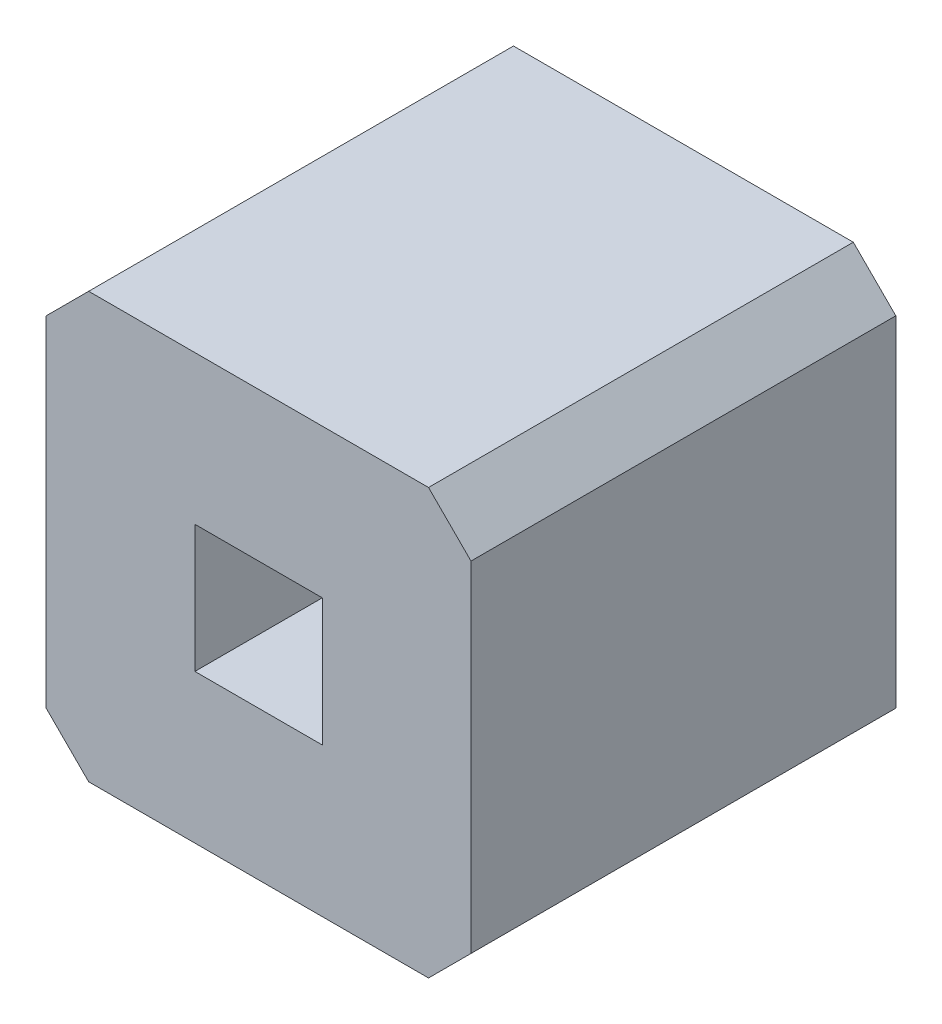
ISO-10303-21;
HEADER;
FILE_DESCRIPTION(('STEP AP214'),'2;1');
FILE_NAME('part.step','',(''),(''),'','','');
FILE_SCHEMA(('AUTOMOTIVE_DESIGN { 1 0 10303 214 1 1 1 1 }'));
ENDSEC;
DATA;
#1=APPLICATION_CONTEXT('core data for automotive mechanical design processes');
#2=APPLICATION_PROTOCOL_DEFINITION('international standard','automotive_design',2000,#1);
#3=PRODUCT_CONTEXT('',#1,'mechanical');
#4=PRODUCT('Part','Part','',(#3));
#5=PRODUCT_RELATED_PRODUCT_CATEGORY('part','',(#4));
#6=PRODUCT_DEFINITION_FORMATION('','',#4);
#7=PRODUCT_DEFINITION_CONTEXT('part definition',#1,'design');
#8=PRODUCT_DEFINITION('design','',#6,#7);
#9=PRODUCT_DEFINITION_SHAPE('','',#8);
#10=(LENGTH_UNIT() NAMED_UNIT(*) SI_UNIT(.MILLI.,.METRE.));
#11=(NAMED_UNIT(*) PLANE_ANGLE_UNIT() SI_UNIT($,.RADIAN.));
#12=(NAMED_UNIT(*) SI_UNIT($,.STERADIAN.) SOLID_ANGLE_UNIT());
#13=UNCERTAINTY_MEASURE_WITH_UNIT(LENGTH_MEASURE(1.E-05),#10,'distance_accuracy_value','');
#14=(GEOMETRIC_REPRESENTATION_CONTEXT(3) GLOBAL_UNCERTAINTY_ASSIGNED_CONTEXT((#13)) GLOBAL_UNIT_ASSIGNED_CONTEXT((#10,
#11,#12)) REPRESENTATION_CONTEXT('',''));
#15=CARTESIAN_POINT('',(0.,0.,0.));
#16=DIRECTION('',(0.,0.,1.));
#17=DIRECTION('',(1.,0.,0.));
#18=AXIS2_PLACEMENT_3D('',#15,#16,#17);
#19=CARTESIAN_POINT('',(0.,0.,2.5));
#20=DIRECTION('',(0.,0.,-1.));
#21=DIRECTION('',(-1.,0.,0.));
#22=AXIS2_PLACEMENT_3D('',#19,#20,#21);
#23=PLANE('',#22);
#24=DIRECTION('',(0.,-1.,0.));
#25=VECTOR('',#24,1.);
#26=CARTESIAN_POINT('',(0.,0.25,2.5));
#27=LINE('',#26,#25);
#28=CARTESIAN_POINT('',(0.,2.25,2.5));
#29=VERTEX_POINT('',#28);
#30=CARTESIAN_POINT('',(0.,0.25,2.5));
#31=VERTEX_POINT('',#30);
#32=EDGE_CURVE('E159',#29,#31,#27,.T.);
#33=ORIENTED_EDGE('',*,*,#32,.T.);
#34=DIRECTION('',(0.707106781186548,-0.707106781186548,0.));
#35=VECTOR('',#34,1.);
#36=CARTESIAN_POINT('',(0.,0.25,2.5));
#37=LINE('',#36,#35);
#38=CARTESIAN_POINT('',(0.25,0.,2.5));
#39=VERTEX_POINT('',#38);
#40=EDGE_CURVE('E162',#31,#39,#37,.T.);
#41=ORIENTED_EDGE('',*,*,#40,.T.);
#42=DIRECTION('',(1.,0.,0.));
#43=VECTOR('',#42,1.);
#44=CARTESIAN_POINT('',(0.25,0.,2.5));
#45=LINE('',#44,#43);
#46=CARTESIAN_POINT('',(2.25,0.,2.5));
#47=VERTEX_POINT('',#46);
#48=EDGE_CURVE('E165',#39,#47,#45,.T.);
#49=ORIENTED_EDGE('',*,*,#48,.T.);
#50=DIRECTION('',(0.707106781186547,0.707106781186548,0.));
#51=VECTOR('',#50,1.);
#52=CARTESIAN_POINT('',(2.25,0.,2.5));
#53=LINE('',#52,#51);
#54=CARTESIAN_POINT('',(2.5,0.25,2.5));
#55=VERTEX_POINT('',#54);
#56=EDGE_CURVE('E167',#47,#55,#53,.T.);
#57=ORIENTED_EDGE('',*,*,#56,.T.);
#58=DIRECTION('',(0.,1.,0.));
#59=VECTOR('',#58,1.);
#60=CARTESIAN_POINT('',(2.5,0.25,2.5));
#61=LINE('',#60,#59);
#62=CARTESIAN_POINT('',(2.5,2.25,2.5));
#63=VERTEX_POINT('',#62);
#64=EDGE_CURVE('E169',#55,#63,#61,.T.);
#65=ORIENTED_EDGE('',*,*,#64,.T.);
#66=DIRECTION('',(-0.707106781186548,0.707106781186548,0.));
#67=VECTOR('',#66,1.);
#68=CARTESIAN_POINT('',(2.25,2.5,2.5));
#69=LINE('',#68,#67);
#70=CARTESIAN_POINT('',(2.25,2.5,2.5));
#71=VERTEX_POINT('',#70);
#72=EDGE_CURVE('E171',#63,#71,#69,.T.);
#73=ORIENTED_EDGE('',*,*,#72,.T.);
#74=DIRECTION('',(-1.,0.,0.));
#75=VECTOR('',#74,1.);
#76=CARTESIAN_POINT('',(0.25,2.5,2.5));
#77=LINE('',#76,#75);
#78=CARTESIAN_POINT('',(0.25,2.5,2.5));
#79=VERTEX_POINT('',#78);
#80=EDGE_CURVE('E173',#71,#79,#77,.T.);
#81=ORIENTED_EDGE('',*,*,#80,.T.);
#82=DIRECTION('',(-0.707106781186548,-0.707106781186547,0.));
#83=VECTOR('',#82,1.);
#84=CARTESIAN_POINT('',(0.,2.25,2.5));
#85=LINE('',#84,#83);
#86=EDGE_CURVE('E175',#79,#29,#85,.T.);
#87=ORIENTED_EDGE('',*,*,#86,.T.);
#88=EDGE_LOOP('',(#33,#41,#49,#57,#65,#73,#81,#87));
#89=FACE_BOUND('',#88,.T.);
#90=DIRECTION('',(0.,-1.,0.));
#91=VECTOR('',#90,1.);
#92=CARTESIAN_POINT('',(0.875,1.625,2.5));
#93=LINE('',#92,#91);
#94=CARTESIAN_POINT('',(0.875,1.625,2.5));
#95=VERTEX_POINT('',#94);
#96=CARTESIAN_POINT('',(0.875,0.875,2.5));
#97=VERTEX_POINT('',#96);
#98=EDGE_CURVE('E123',#95,#97,#93,.T.);
#99=ORIENTED_EDGE('',*,*,#98,.F.);
#100=DIRECTION('',(-1.,0.,0.));
#101=VECTOR('',#100,1.);
#102=CARTESIAN_POINT('',(0.875,1.625,2.5));
#103=LINE('',#102,#101);
#104=CARTESIAN_POINT('',(1.625,1.625,2.5));
#105=VERTEX_POINT('',#104);
#106=EDGE_CURVE('E145',#105,#95,#103,.T.);
#107=ORIENTED_EDGE('',*,*,#106,.F.);
#108=DIRECTION('',(0.,1.,0.));
#109=VECTOR('',#108,1.);
#110=CARTESIAN_POINT('',(1.625,1.625,2.5));
#111=LINE('',#110,#109);
#112=CARTESIAN_POINT('',(1.625,0.875,2.5));
#113=VERTEX_POINT('',#112);
#114=EDGE_CURVE('E143',#113,#105,#111,.T.);
#115=ORIENTED_EDGE('',*,*,#114,.F.);
#116=DIRECTION('',(1.,0.,0.));
#117=VECTOR('',#116,1.);
#118=CARTESIAN_POINT('',(0.875,0.875,2.5));
#119=LINE('',#118,#117);
#120=EDGE_CURVE('E131',#97,#113,#119,.T.);
#121=ORIENTED_EDGE('',*,*,#120,.F.);
#122=EDGE_LOOP('',(#99,#107,#115,#121));
#123=FACE_BOUND('',#122,.T.);
#124=ADVANCED_FACE('F34',(#89,#123),#23,.F.);
#125=CARTESIAN_POINT('',(0.,0.,0.));
#126=DIRECTION('',(0.,0.,-1.));
#127=DIRECTION('',(-1.,0.,0.));
#128=AXIS2_PLACEMENT_3D('',#125,#126,#127);
#129=PLANE('',#128);
#130=DIRECTION('',(0.,-1.,0.));
#131=VECTOR('',#130,1.);
#132=CARTESIAN_POINT('',(0.,0.25,0.));
#133=LINE('',#132,#131);
#134=CARTESIAN_POINT('',(0.,2.25,0.));
#135=VERTEX_POINT('',#134);
#136=CARTESIAN_POINT('',(0.,0.25,0.));
#137=VERTEX_POINT('',#136);
#138=EDGE_CURVE('E139',#135,#137,#133,.T.);
#139=ORIENTED_EDGE('',*,*,#138,.F.);
#140=DIRECTION('',(-0.707106781186548,-0.707106781186547,0.));
#141=VECTOR('',#140,1.);
#142=CARTESIAN_POINT('',(0.,2.25,0.));
#143=LINE('',#142,#141);
#144=CARTESIAN_POINT('',(0.25,2.5,0.));
#145=VERTEX_POINT('',#144);
#146=EDGE_CURVE('E163',#145,#135,#143,.T.);
#147=ORIENTED_EDGE('',*,*,#146,.F.);
#148=DIRECTION('',(-1.,0.,0.));
#149=VECTOR('',#148,1.);
#150=CARTESIAN_POINT('',(0.25,2.5,0.));
#151=LINE('',#150,#149);
#152=CARTESIAN_POINT('',(2.25,2.5,0.));
#153=VERTEX_POINT('',#152);
#154=EDGE_CURVE('E190',#153,#145,#151,.T.);
#155=ORIENTED_EDGE('',*,*,#154,.F.);
#156=DIRECTION('',(-0.707106781186548,0.707106781186548,0.));
#157=VECTOR('',#156,1.);
#158=CARTESIAN_POINT('',(2.25,2.5,0.));
#159=LINE('',#158,#157);
#160=CARTESIAN_POINT('',(2.5,2.25,0.));
#161=VERTEX_POINT('',#160);
#162=EDGE_CURVE('E188',#161,#153,#159,.T.);
#163=ORIENTED_EDGE('',*,*,#162,.F.);
#164=DIRECTION('',(0.,1.,0.));
#165=VECTOR('',#164,1.);
#166=CARTESIAN_POINT('',(2.5,0.25,0.));
#167=LINE('',#166,#165);
#168=CARTESIAN_POINT('',(2.5,0.25,0.));
#169=VERTEX_POINT('',#168);
#170=EDGE_CURVE('E186',#169,#161,#167,.T.);
#171=ORIENTED_EDGE('',*,*,#170,.F.);
#172=DIRECTION('',(0.707106781186547,0.707106781186548,0.));
#173=VECTOR('',#172,1.);
#174=CARTESIAN_POINT('',(2.25,0.,0.));
#175=LINE('',#174,#173);
#176=CARTESIAN_POINT('',(2.25,0.,0.));
#177=VERTEX_POINT('',#176);
#178=EDGE_CURVE('E184',#177,#169,#175,.T.);
#179=ORIENTED_EDGE('',*,*,#178,.F.);
#180=DIRECTION('',(1.,0.,0.));
#181=VECTOR('',#180,1.);
#182=CARTESIAN_POINT('',(0.25,0.,0.));
#183=LINE('',#182,#181);
#184=CARTESIAN_POINT('',(0.25,0.,0.));
#185=VERTEX_POINT('',#184);
#186=EDGE_CURVE('E182',#185,#177,#183,.T.);
#187=ORIENTED_EDGE('',*,*,#186,.F.);
#188=DIRECTION('',(0.707106781186548,-0.707106781186548,0.));
#189=VECTOR('',#188,1.);
#190=CARTESIAN_POINT('',(0.,0.25,0.));
#191=LINE('',#190,#189);
#192=EDGE_CURVE('E180',#137,#185,#191,.T.);
#193=ORIENTED_EDGE('',*,*,#192,.F.);
#194=EDGE_LOOP('',(#139,#147,#155,#163,#171,#179,#187,#193));
#195=FACE_BOUND('',#194,.T.);
#196=DIRECTION('',(-1.,0.,0.));
#197=VECTOR('',#196,1.);
#198=CARTESIAN_POINT('',(0.875,1.625,0.));
#199=LINE('',#198,#197);
#200=CARTESIAN_POINT('',(1.625,1.625,0.));
#201=VERTEX_POINT('',#200);
#202=CARTESIAN_POINT('',(0.875,1.625,0.));
#203=VERTEX_POINT('',#202);
#204=EDGE_CURVE('E132',#201,#203,#199,.T.);
#205=ORIENTED_EDGE('',*,*,#204,.T.);
#206=DIRECTION('',(0.,-1.,0.));
#207=VECTOR('',#206,1.);
#208=CARTESIAN_POINT('',(0.875,1.625,0.));
#209=LINE('',#208,#207);
#210=CARTESIAN_POINT('',(0.875,0.875,0.));
#211=VERTEX_POINT('',#210);
#212=EDGE_CURVE('E57',#203,#211,#209,.T.);
#213=ORIENTED_EDGE('',*,*,#212,.T.);
#214=DIRECTION('',(1.,0.,0.));
#215=VECTOR('',#214,1.);
#216=CARTESIAN_POINT('',(0.875,0.875,0.));
#217=LINE('',#216,#215);
#218=CARTESIAN_POINT('',(1.625,0.875,0.));
#219=VERTEX_POINT('',#218);
#220=EDGE_CURVE('E138',#211,#219,#217,.T.);
#221=ORIENTED_EDGE('',*,*,#220,.T.);
#222=DIRECTION('',(0.,1.,0.));
#223=VECTOR('',#222,1.);
#224=CARTESIAN_POINT('',(1.625,1.625,0.));
#225=LINE('',#224,#223);
#226=EDGE_CURVE('E151',#219,#201,#225,.T.);
#227=ORIENTED_EDGE('',*,*,#226,.T.);
#228=EDGE_LOOP('',(#205,#213,#221,#227));
#229=FACE_BOUND('',#228,.T.);
#230=ADVANCED_FACE('F220',(#195,#229),#129,.T.);
#231=CARTESIAN_POINT('',(0.,0.25,2.5));
#232=DIRECTION('',(1.,0.,0.));
#233=DIRECTION('',(0.,0.,-1.));
#234=AXIS2_PLACEMENT_3D('',#231,#232,#233);
#235=PLANE('',#234);
#236=ORIENTED_EDGE('',*,*,#138,.T.);
#237=DIRECTION('',(0.,0.,-1.));
#238=VECTOR('',#237,1.);
#239=CARTESIAN_POINT('',(0.,0.25,2.5));
#240=LINE('',#239,#238);
#241=EDGE_CURVE('E11',#31,#137,#240,.T.);
#242=ORIENTED_EDGE('',*,*,#241,.F.);
#243=ORIENTED_EDGE('',*,*,#32,.F.);
#244=DIRECTION('',(0.,0.,-1.));
#245=VECTOR('',#244,1.);
#246=CARTESIAN_POINT('',(0.,2.25,2.5));
#247=LINE('',#246,#245);
#248=EDGE_CURVE('E177',#29,#135,#247,.T.);
#249=ORIENTED_EDGE('',*,*,#248,.T.);
#250=EDGE_LOOP('',(#236,#242,#243,#249));
#251=FACE_BOUND('',#250,.T.);
#252=ADVANCED_FACE('F36',(#251),#235,.F.);
#253=CARTESIAN_POINT('',(0.,0.25,2.5));
#254=DIRECTION('',(0.707106781186548,0.707106781186548,0.));
#255=DIRECTION('',(-0.707106781186548,0.707106781186548,0.));
#256=AXIS2_PLACEMENT_3D('',#253,#254,#255);
#257=PLANE('',#256);
#258=ORIENTED_EDGE('',*,*,#192,.T.);
#259=DIRECTION('',(0.,0.,-1.));
#260=VECTOR('',#259,1.);
#261=CARTESIAN_POINT('',(0.25,0.,2.5));
#262=LINE('',#261,#260);
#263=EDGE_CURVE('E42',#39,#185,#262,.T.);
#264=ORIENTED_EDGE('',*,*,#263,.F.);
#265=ORIENTED_EDGE('',*,*,#40,.F.);
#266=ORIENTED_EDGE('',*,*,#241,.T.);
#267=EDGE_LOOP('',(#258,#264,#265,#266));
#268=FACE_BOUND('',#267,.T.);
#269=ADVANCED_FACE('F237',(#268),#257,.F.);
#270=CARTESIAN_POINT('',(0.25,0.,2.5));
#271=DIRECTION('',(0.,1.,0.));
#272=DIRECTION('',(0.,0.,1.));
#273=AXIS2_PLACEMENT_3D('',#270,#271,#272);
#274=PLANE('',#273);
#275=ORIENTED_EDGE('',*,*,#186,.T.);
#276=DIRECTION('',(0.,0.,-1.));
#277=VECTOR('',#276,1.);
#278=CARTESIAN_POINT('',(2.25,0.,2.5));
#279=LINE('',#278,#277);
#280=EDGE_CURVE('E207',#47,#177,#279,.T.);
#281=ORIENTED_EDGE('',*,*,#280,.F.);
#282=ORIENTED_EDGE('',*,*,#48,.F.);
#283=ORIENTED_EDGE('',*,*,#263,.T.);
#284=EDGE_LOOP('',(#275,#281,#282,#283));
#285=FACE_BOUND('',#284,.T.);
#286=ADVANCED_FACE('F214',(#285),#274,.F.);
#287=CARTESIAN_POINT('',(2.25,0.,2.5));
#288=DIRECTION('',(-0.707106781186548,0.707106781186547,0.));
#289=DIRECTION('',(-0.707106781186547,-0.707106781186548,0.));
#290=AXIS2_PLACEMENT_3D('',#287,#288,#289);
#291=PLANE('',#290);
#292=ORIENTED_EDGE('',*,*,#178,.T.);
#293=DIRECTION('',(0.,0.,-1.));
#294=VECTOR('',#293,1.);
#295=CARTESIAN_POINT('',(2.5,0.25,2.5));
#296=LINE('',#295,#294);
#297=EDGE_CURVE('E204',#55,#169,#296,.T.);
#298=ORIENTED_EDGE('',*,*,#297,.F.);
#299=ORIENTED_EDGE('',*,*,#56,.F.);
#300=ORIENTED_EDGE('',*,*,#280,.T.);
#301=EDGE_LOOP('',(#292,#298,#299,#300));
#302=FACE_BOUND('',#301,.T.);
#303=ADVANCED_FACE('F226',(#302),#291,.F.);
#304=CARTESIAN_POINT('',(2.5,0.25,2.5));
#305=DIRECTION('',(-1.,0.,0.));
#306=DIRECTION('',(0.,0.,1.));
#307=AXIS2_PLACEMENT_3D('',#304,#305,#306);
#308=PLANE('',#307);
#309=ORIENTED_EDGE('',*,*,#170,.T.);
#310=DIRECTION('',(0.,0.,-1.));
#311=VECTOR('',#310,1.);
#312=CARTESIAN_POINT('',(2.5,2.25,2.5));
#313=LINE('',#312,#311);
#314=EDGE_CURVE('E201',#63,#161,#313,.T.);
#315=ORIENTED_EDGE('',*,*,#314,.F.);
#316=ORIENTED_EDGE('',*,*,#64,.F.);
#317=ORIENTED_EDGE('',*,*,#297,.T.);
#318=EDGE_LOOP('',(#309,#315,#316,#317));
#319=FACE_BOUND('',#318,.T.);
#320=ADVANCED_FACE('F230',(#319),#308,.F.);
#321=CARTESIAN_POINT('',(2.25,2.5,2.5));
#322=DIRECTION('',(-0.707106781186548,-0.707106781186548,0.));
#323=DIRECTION('',(0.707106781186548,-0.707106781186548,0.));
#324=AXIS2_PLACEMENT_3D('',#321,#322,#323);
#325=PLANE('',#324);
#326=ORIENTED_EDGE('',*,*,#162,.T.);
#327=DIRECTION('',(0.,0.,-1.));
#328=VECTOR('',#327,1.);
#329=CARTESIAN_POINT('',(2.25,2.5,2.5));
#330=LINE('',#329,#328);
#331=EDGE_CURVE('E198',#71,#153,#330,.T.);
#332=ORIENTED_EDGE('',*,*,#331,.F.);
#333=ORIENTED_EDGE('',*,*,#72,.F.);
#334=ORIENTED_EDGE('',*,*,#314,.T.);
#335=EDGE_LOOP('',(#326,#332,#333,#334));
#336=FACE_BOUND('',#335,.T.);
#337=ADVANCED_FACE('F250',(#336),#325,.F.);
#338=CARTESIAN_POINT('',(0.25,2.5,2.5));
#339=DIRECTION('',(0.,-1.,0.));
#340=DIRECTION('',(0.,0.,-1.));
#341=AXIS2_PLACEMENT_3D('',#338,#339,#340);
#342=PLANE('',#341);
#343=ORIENTED_EDGE('',*,*,#154,.T.);
#344=DIRECTION('',(0.,0.,-1.));
#345=VECTOR('',#344,1.);
#346=CARTESIAN_POINT('',(0.25,2.5,2.5));
#347=LINE('',#346,#345);
#348=EDGE_CURVE('E195',#79,#145,#347,.T.);
#349=ORIENTED_EDGE('',*,*,#348,.F.);
#350=ORIENTED_EDGE('',*,*,#80,.F.);
#351=ORIENTED_EDGE('',*,*,#331,.T.);
#352=EDGE_LOOP('',(#343,#349,#350,#351));
#353=FACE_BOUND('',#352,.T.);
#354=ADVANCED_FACE('F248',(#353),#342,.F.);
#355=CARTESIAN_POINT('',(0.,2.25,2.5));
#356=DIRECTION('',(0.707106781186547,-0.707106781186548,0.));
#357=DIRECTION('',(0.707106781186548,0.707106781186547,0.));
#358=AXIS2_PLACEMENT_3D('',#355,#356,#357);
#359=PLANE('',#358);
#360=ORIENTED_EDGE('',*,*,#146,.T.);
#361=ORIENTED_EDGE('',*,*,#248,.F.);
#362=ORIENTED_EDGE('',*,*,#86,.F.);
#363=ORIENTED_EDGE('',*,*,#348,.T.);
#364=EDGE_LOOP('',(#360,#361,#362,#363));
#365=FACE_BOUND('',#364,.T.);
#366=ADVANCED_FACE('F243',(#365),#359,.F.);
#367=CARTESIAN_POINT('',(0.875,1.625,2.5));
#368=DIRECTION('',(1.,0.,0.));
#369=DIRECTION('',(0.,0.,-1.));
#370=AXIS2_PLACEMENT_3D('',#367,#368,#369);
#371=PLANE('',#370);
#372=ORIENTED_EDGE('',*,*,#212,.F.);
#373=DIRECTION('',(0.,0.,-1.));
#374=VECTOR('',#373,1.);
#375=CARTESIAN_POINT('',(0.875,1.625,2.5));
#376=LINE('',#375,#374);
#377=EDGE_CURVE('E127',#95,#203,#376,.T.);
#378=ORIENTED_EDGE('',*,*,#377,.F.);
#379=ORIENTED_EDGE('',*,*,#98,.T.);
#380=DIRECTION('',(0.,0.,-1.));
#381=VECTOR('',#380,1.);
#382=CARTESIAN_POINT('',(0.875,0.875,2.5));
#383=LINE('',#382,#381);
#384=EDGE_CURVE('E126',#97,#211,#383,.T.);
#385=ORIENTED_EDGE('',*,*,#384,.T.);
#386=EDGE_LOOP('',(#372,#378,#379,#385));
#387=FACE_BOUND('',#386,.T.);
#388=ADVANCED_FACE('F125',(#387),#371,.T.);
#389=CARTESIAN_POINT('',(0.875,0.875,2.5));
#390=DIRECTION('',(0.,1.,0.));
#391=DIRECTION('',(0.,0.,1.));
#392=AXIS2_PLACEMENT_3D('',#389,#390,#391);
#393=PLANE('',#392);
#394=ORIENTED_EDGE('',*,*,#220,.F.);
#395=ORIENTED_EDGE('',*,*,#384,.F.);
#396=ORIENTED_EDGE('',*,*,#120,.T.);
#397=DIRECTION('',(0.,0.,-1.));
#398=VECTOR('',#397,1.);
#399=CARTESIAN_POINT('',(1.625,0.875,2.5));
#400=LINE('',#399,#398);
#401=EDGE_CURVE('E140',#113,#219,#400,.T.);
#402=ORIENTED_EDGE('',*,*,#401,.T.);
#403=EDGE_LOOP('',(#394,#395,#396,#402));
#404=FACE_BOUND('',#403,.T.);
#405=ADVANCED_FACE('F135',(#404),#393,.T.);
#406=CARTESIAN_POINT('',(1.625,1.625,2.5));
#407=DIRECTION('',(-1.,0.,0.));
#408=DIRECTION('',(0.,0.,1.));
#409=AXIS2_PLACEMENT_3D('',#406,#407,#408);
#410=PLANE('',#409);
#411=ORIENTED_EDGE('',*,*,#226,.F.);
#412=ORIENTED_EDGE('',*,*,#401,.F.);
#413=ORIENTED_EDGE('',*,*,#114,.T.);
#414=DIRECTION('',(0.,0.,-1.));
#415=VECTOR('',#414,1.);
#416=CARTESIAN_POINT('',(1.625,1.625,2.5));
#417=LINE('',#416,#415);
#418=EDGE_CURVE('E49',#105,#201,#417,.T.);
#419=ORIENTED_EDGE('',*,*,#418,.T.);
#420=EDGE_LOOP('',(#411,#412,#413,#419));
#421=FACE_BOUND('',#420,.T.);
#422=ADVANCED_FACE('F275',(#421),#410,.T.);
#423=CARTESIAN_POINT('',(0.875,1.625,2.5));
#424=DIRECTION('',(0.,-1.,0.));
#425=DIRECTION('',(1.,0.,0.));
#426=AXIS2_PLACEMENT_3D('',#423,#424,#425);
#427=PLANE('',#426);
#428=ORIENTED_EDGE('',*,*,#204,.F.);
#429=ORIENTED_EDGE('',*,*,#418,.F.);
#430=ORIENTED_EDGE('',*,*,#106,.T.);
#431=ORIENTED_EDGE('',*,*,#377,.T.);
#432=EDGE_LOOP('',(#428,#429,#430,#431));
#433=FACE_BOUND('',#432,.T.);
#434=ADVANCED_FACE('F279',(#433),#427,.T.);
#435=CLOSED_SHELL('',(#124,#230,#252,#269,#286,#303,#320,#337,#354,#366,#388,#405,#422,#434));
#436=MANIFOLD_SOLID_BREP('B2',#435);
#437=ADVANCED_BREP_SHAPE_REPRESENTATION('',(#18,#436),#14);
#438=SHAPE_DEFINITION_REPRESENTATION(#9,#437);
ENDSEC;
END-ISO-10303-21;
